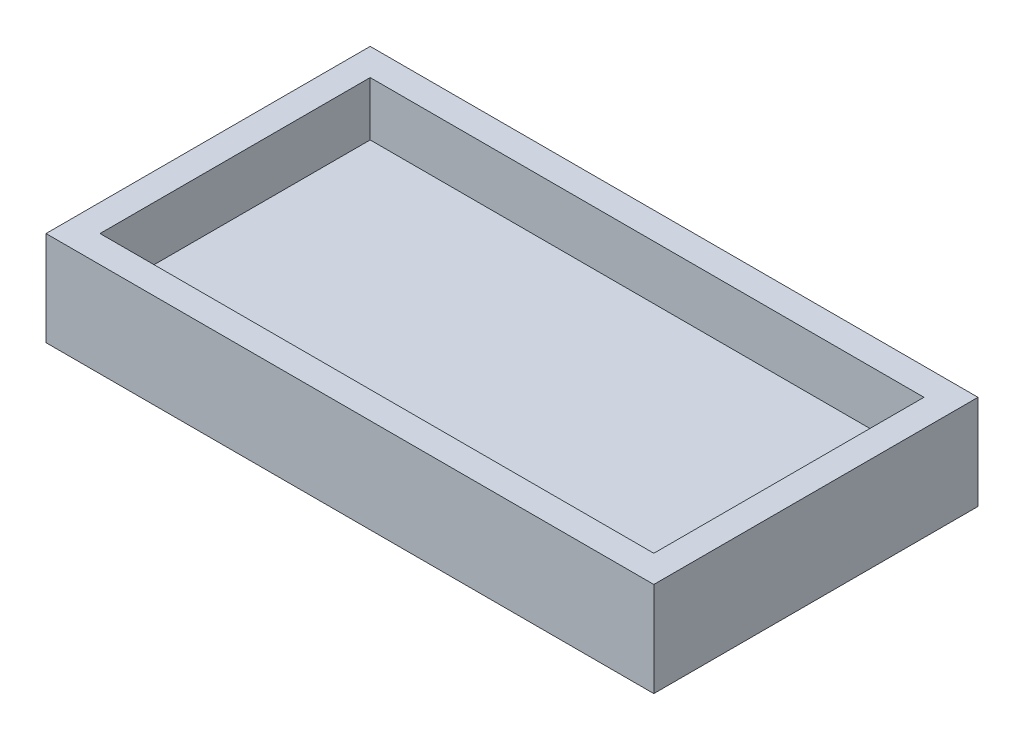
ISO-10303-21;
HEADER;
FILE_DESCRIPTION(('STEP AP214'),'2;1');
FILE_NAME('part.step','',(''),(''),'','','');
FILE_SCHEMA(('AUTOMOTIVE_DESIGN { 1 0 10303 214 1 1 1 1 }'));
ENDSEC;
DATA;
#1=APPLICATION_CONTEXT('core data for automotive mechanical design processes');
#2=APPLICATION_PROTOCOL_DEFINITION('international standard','automotive_design',2000,#1);
#3=PRODUCT_CONTEXT('',#1,'mechanical');
#4=PRODUCT('Part','Part','',(#3));
#5=PRODUCT_RELATED_PRODUCT_CATEGORY('part','',(#4));
#6=PRODUCT_DEFINITION_FORMATION('','',#4);
#7=PRODUCT_DEFINITION_CONTEXT('part definition',#1,'design');
#8=PRODUCT_DEFINITION('design','',#6,#7);
#9=PRODUCT_DEFINITION_SHAPE('','',#8);
#10=(LENGTH_UNIT() NAMED_UNIT(*) SI_UNIT(.MILLI.,.METRE.));
#11=(NAMED_UNIT(*) PLANE_ANGLE_UNIT() SI_UNIT($,.RADIAN.));
#12=(NAMED_UNIT(*) SI_UNIT($,.STERADIAN.) SOLID_ANGLE_UNIT());
#13=UNCERTAINTY_MEASURE_WITH_UNIT(LENGTH_MEASURE(1.E-05),#10,'distance_accuracy_value','');
#14=(GEOMETRIC_REPRESENTATION_CONTEXT(3) GLOBAL_UNCERTAINTY_ASSIGNED_CONTEXT((#13)) GLOBAL_UNIT_ASSIGNED_CONTEXT((#10,
#11,#12)) REPRESENTATION_CONTEXT('',''));
#15=CARTESIAN_POINT('',(0.,0.,0.));
#16=DIRECTION('',(0.,0.,1.));
#17=DIRECTION('',(1.,0.,0.));
#18=AXIS2_PLACEMENT_3D('',#15,#16,#17);
#19=CARTESIAN_POINT('',(0.,3.,0.));
#20=DIRECTION('',(0.,1.,0.));
#21=DIRECTION('',(0.,0.,1.));
#22=AXIS2_PLACEMENT_3D('',#19,#20,#21);
#23=PLANE('',#22);
#24=DIRECTION('',(0.,0.,-1.));
#25=VECTOR('',#24,1.);
#26=CARTESIAN_POINT('',(20.5,3.,-10.));
#27=LINE('',#26,#25);
#28=CARTESIAN_POINT('',(20.5,3.,10.));
#29=VERTEX_POINT('',#28);
#30=CARTESIAN_POINT('',(20.5,3.,-10.));
#31=VERTEX_POINT('',#30);
#32=EDGE_CURVE('E147',#29,#31,#27,.T.);
#33=ORIENTED_EDGE('',*,*,#32,.T.);
#34=DIRECTION('',(-1.,0.,0.));
#35=VECTOR('',#34,1.);
#36=CARTESIAN_POINT('',(-20.5,3.,-10.));
#37=LINE('',#36,#35);
#38=CARTESIAN_POINT('',(-20.5,3.,-10.));
#39=VERTEX_POINT('',#38);
#40=EDGE_CURVE('E60',#31,#39,#37,.T.);
#41=ORIENTED_EDGE('',*,*,#40,.T.);
#42=DIRECTION('',(0.,0.,1.));
#43=VECTOR('',#42,1.);
#44=CARTESIAN_POINT('',(-20.5,3.,-10.));
#45=LINE('',#44,#43);
#46=CARTESIAN_POINT('',(-20.5,3.,9.99999999999999));
#47=VERTEX_POINT('',#46);
#48=EDGE_CURVE('E45',#39,#47,#45,.T.);
#49=ORIENTED_EDGE('',*,*,#48,.T.);
#50=DIRECTION('',(1.,0.,0.));
#51=VECTOR('',#50,1.);
#52=CARTESIAN_POINT('',(-20.5,3.,10.));
#53=LINE('',#52,#51);
#54=EDGE_CURVE('E12',#47,#29,#53,.T.);
#55=ORIENTED_EDGE('',*,*,#54,.T.);
#56=EDGE_LOOP('',(#33,#41,#49,#55));
#57=FACE_BOUND('',#56,.T.);
#58=ADVANCED_FACE('F37',(#57),#23,.T.);
#59=CARTESIAN_POINT('',(22.5,62.,-12.));
#60=DIRECTION('',(0.,0.,-1.));
#61=DIRECTION('',(-1.,0.,0.));
#62=AXIS2_PLACEMENT_3D('',#59,#60,#61);
#63=PLANE('',#62);
#64=DIRECTION('',(0.,-1.,0.));
#65=VECTOR('',#64,1.);
#66=CARTESIAN_POINT('',(-22.5,62.,-12.));
#67=LINE('',#66,#65);
#68=CARTESIAN_POINT('',(-22.5,7.,-12.));
#69=VERTEX_POINT('',#68);
#70=CARTESIAN_POINT('',(-22.5,0.,-12.));
#71=VERTEX_POINT('',#70);
#72=EDGE_CURVE('E115',#69,#71,#67,.T.);
#73=ORIENTED_EDGE('',*,*,#72,.F.);
#74=DIRECTION('',(1.,0.,0.));
#75=VECTOR('',#74,1.);
#76=CARTESIAN_POINT('',(22.5,7.,-12.));
#77=LINE('',#76,#75);
#78=CARTESIAN_POINT('',(22.5,7.,-12.));
#79=VERTEX_POINT('',#78);
#80=EDGE_CURVE('E148',#69,#79,#77,.T.);
#81=ORIENTED_EDGE('',*,*,#80,.T.);
#82=DIRECTION('',(0.,-1.,0.));
#83=VECTOR('',#82,1.);
#84=CARTESIAN_POINT('',(22.5,62.,-12.));
#85=LINE('',#84,#83);
#86=CARTESIAN_POINT('',(22.5,0.,-12.));
#87=VERTEX_POINT('',#86);
#88=EDGE_CURVE('E129',#79,#87,#85,.T.);
#89=ORIENTED_EDGE('',*,*,#88,.T.);
#90=DIRECTION('',(1.,0.,0.));
#91=VECTOR('',#90,1.);
#92=CARTESIAN_POINT('',(22.5,0.,-12.));
#93=LINE('',#92,#91);
#94=EDGE_CURVE('E134',#71,#87,#93,.T.);
#95=ORIENTED_EDGE('',*,*,#94,.F.);
#96=EDGE_LOOP('',(#73,#81,#89,#95));
#97=FACE_BOUND('',#96,.T.);
#98=ADVANCED_FACE('F182',(#97),#63,.T.);
#99=CARTESIAN_POINT('',(-22.5,62.,-12.));
#100=DIRECTION('',(-1.,0.,0.));
#101=DIRECTION('',(0.,0.,1.));
#102=AXIS2_PLACEMENT_3D('',#99,#100,#101);
#103=PLANE('',#102);
#104=DIRECTION('',(0.,-1.,0.));
#105=VECTOR('',#104,1.);
#106=CARTESIAN_POINT('',(-22.5,62.,12.));
#107=LINE('',#106,#105);
#108=CARTESIAN_POINT('',(-22.5,7.,12.));
#109=VERTEX_POINT('',#108);
#110=CARTESIAN_POINT('',(-22.5,0.,12.));
#111=VERTEX_POINT('',#110);
#112=EDGE_CURVE('E114',#109,#111,#107,.T.);
#113=ORIENTED_EDGE('',*,*,#112,.F.);
#114=DIRECTION('',(0.,0.,-1.));
#115=VECTOR('',#114,1.);
#116=CARTESIAN_POINT('',(-22.5,7.,-12.));
#117=LINE('',#116,#115);
#118=EDGE_CURVE('E111',#109,#69,#117,.T.);
#119=ORIENTED_EDGE('',*,*,#118,.T.);
#120=ORIENTED_EDGE('',*,*,#72,.T.);
#121=DIRECTION('',(0.,0.,-1.));
#122=VECTOR('',#121,1.);
#123=CARTESIAN_POINT('',(-22.5,0.,-12.));
#124=LINE('',#123,#122);
#125=EDGE_CURVE('E143',#111,#71,#124,.T.);
#126=ORIENTED_EDGE('',*,*,#125,.F.);
#127=EDGE_LOOP('',(#113,#119,#120,#126));
#128=FACE_BOUND('',#127,.T.);
#129=ADVANCED_FACE('F186',(#128),#103,.T.);
#130=CARTESIAN_POINT('',(22.5,62.,12.));
#131=DIRECTION('',(0.,0.,1.));
#132=DIRECTION('',(1.,0.,0.));
#133=AXIS2_PLACEMENT_3D('',#130,#131,#132);
#134=PLANE('',#133);
#135=DIRECTION('',(0.,-1.,0.));
#136=VECTOR('',#135,1.);
#137=CARTESIAN_POINT('',(22.5,62.,12.));
#138=LINE('',#137,#136);
#139=CARTESIAN_POINT('',(22.5,7.,12.));
#140=VERTEX_POINT('',#139);
#141=CARTESIAN_POINT('',(22.5,0.,12.));
#142=VERTEX_POINT('',#141);
#143=EDGE_CURVE('E118',#140,#142,#138,.T.);
#144=ORIENTED_EDGE('',*,*,#143,.F.);
#145=DIRECTION('',(-1.,0.,0.));
#146=VECTOR('',#145,1.);
#147=CARTESIAN_POINT('',(22.5,7.,12.));
#148=LINE('',#147,#146);
#149=EDGE_CURVE('E103',#140,#109,#148,.T.);
#150=ORIENTED_EDGE('',*,*,#149,.T.);
#151=ORIENTED_EDGE('',*,*,#112,.T.);
#152=DIRECTION('',(-1.,0.,0.));
#153=VECTOR('',#152,1.);
#154=CARTESIAN_POINT('',(22.5,0.,12.));
#155=LINE('',#154,#153);
#156=EDGE_CURVE('E121',#142,#111,#155,.T.);
#157=ORIENTED_EDGE('',*,*,#156,.F.);
#158=EDGE_LOOP('',(#144,#150,#151,#157));
#159=FACE_BOUND('',#158,.T.);
#160=ADVANCED_FACE('F119',(#159),#134,.T.);
#161=CARTESIAN_POINT('',(22.5,62.,-12.));
#162=DIRECTION('',(1.,0.,0.));
#163=DIRECTION('',(0.,0.,-1.));
#164=AXIS2_PLACEMENT_3D('',#161,#162,#163);
#165=PLANE('',#164);
#166=ORIENTED_EDGE('',*,*,#88,.F.);
#167=DIRECTION('',(0.,0.,1.));
#168=VECTOR('',#167,1.);
#169=CARTESIAN_POINT('',(22.5,7.,-12.));
#170=LINE('',#169,#168);
#171=EDGE_CURVE('E108',#79,#140,#170,.T.);
#172=ORIENTED_EDGE('',*,*,#171,.T.);
#173=ORIENTED_EDGE('',*,*,#143,.T.);
#174=DIRECTION('',(0.,0.,1.));
#175=VECTOR('',#174,1.);
#176=CARTESIAN_POINT('',(22.5,0.,-12.));
#177=LINE('',#176,#175);
#178=EDGE_CURVE('E270',#87,#142,#177,.T.);
#179=ORIENTED_EDGE('',*,*,#178,.F.);
#180=EDGE_LOOP('',(#166,#172,#173,#179));
#181=FACE_BOUND('',#180,.T.);
#182=ADVANCED_FACE('F128',(#181),#165,.T.);
#183=CARTESIAN_POINT('',(20.5,62.,-10.));
#184=DIRECTION('',(1.,0.,0.));
#185=DIRECTION('',(0.,0.,-1.));
#186=AXIS2_PLACEMENT_3D('',#183,#184,#185);
#187=PLANE('',#186);
#188=ORIENTED_EDGE('',*,*,#32,.F.);
#189=DIRECTION('',(0.,-1.,0.));
#190=VECTOR('',#189,1.);
#191=CARTESIAN_POINT('',(20.5,62.,10.));
#192=LINE('',#191,#190);
#193=CARTESIAN_POINT('',(20.5,7.,10.));
#194=VERTEX_POINT('',#193);
#195=EDGE_CURVE('E52',#194,#29,#192,.T.);
#196=ORIENTED_EDGE('',*,*,#195,.F.);
#197=DIRECTION('',(0.,0.,1.));
#198=VECTOR('',#197,1.);
#199=CARTESIAN_POINT('',(20.5,7.,-10.));
#200=LINE('',#199,#198);
#201=CARTESIAN_POINT('',(20.5,7.,-10.));
#202=VERTEX_POINT('',#201);
#203=EDGE_CURVE('E136',#202,#194,#200,.T.);
#204=ORIENTED_EDGE('',*,*,#203,.F.);
#205=DIRECTION('',(0.,-1.,0.));
#206=VECTOR('',#205,1.);
#207=CARTESIAN_POINT('',(20.5,62.,-10.));
#208=LINE('',#207,#206);
#209=EDGE_CURVE('E125',#202,#31,#208,.T.);
#210=ORIENTED_EDGE('',*,*,#209,.T.);
#211=EDGE_LOOP('',(#188,#196,#204,#210));
#212=FACE_BOUND('',#211,.T.);
#213=ADVANCED_FACE('F189',(#212),#187,.F.);
#214=CARTESIAN_POINT('',(20.5,62.,-10.));
#215=DIRECTION('',(0.,0.,-1.));
#216=DIRECTION('',(-1.,0.,0.));
#217=AXIS2_PLACEMENT_3D('',#214,#215,#216);
#218=PLANE('',#217);
#219=ORIENTED_EDGE('',*,*,#40,.F.);
#220=ORIENTED_EDGE('',*,*,#209,.F.);
#221=DIRECTION('',(1.,0.,0.));
#222=VECTOR('',#221,1.);
#223=CARTESIAN_POINT('',(20.5,7.,-10.));
#224=LINE('',#223,#222);
#225=CARTESIAN_POINT('',(-20.5,7.,-10.));
#226=VERTEX_POINT('',#225);
#227=EDGE_CURVE('E140',#226,#202,#224,.T.);
#228=ORIENTED_EDGE('',*,*,#227,.F.);
#229=DIRECTION('',(0.,-1.,0.));
#230=VECTOR('',#229,1.);
#231=CARTESIAN_POINT('',(-20.5,62.,-10.));
#232=LINE('',#231,#230);
#233=EDGE_CURVE('E156',#226,#39,#232,.T.);
#234=ORIENTED_EDGE('',*,*,#233,.T.);
#235=EDGE_LOOP('',(#219,#220,#228,#234));
#236=FACE_BOUND('',#235,.T.);
#237=ADVANCED_FACE('F170',(#236),#218,.F.);
#238=CARTESIAN_POINT('',(-20.5,62.,-10.));
#239=DIRECTION('',(-1.,0.,0.));
#240=DIRECTION('',(0.,0.,1.));
#241=AXIS2_PLACEMENT_3D('',#238,#239,#240);
#242=PLANE('',#241);
#243=ORIENTED_EDGE('',*,*,#48,.F.);
#244=ORIENTED_EDGE('',*,*,#233,.F.);
#245=DIRECTION('',(0.,0.,-1.));
#246=VECTOR('',#245,1.);
#247=CARTESIAN_POINT('',(-20.5,7.,-10.));
#248=LINE('',#247,#246);
#249=CARTESIAN_POINT('',(-20.5,7.,9.99999999999999));
#250=VERTEX_POINT('',#249);
#251=EDGE_CURVE('E144',#250,#226,#248,.T.);
#252=ORIENTED_EDGE('',*,*,#251,.F.);
#253=DIRECTION('',(0.,-1.,0.));
#254=VECTOR('',#253,1.);
#255=CARTESIAN_POINT('',(-20.5,62.,9.99999999999999));
#256=LINE('',#255,#254);
#257=EDGE_CURVE('E158',#250,#47,#256,.T.);
#258=ORIENTED_EDGE('',*,*,#257,.T.);
#259=EDGE_LOOP('',(#243,#244,#252,#258));
#260=FACE_BOUND('',#259,.T.);
#261=ADVANCED_FACE('F168',(#260),#242,.F.);
#262=CARTESIAN_POINT('',(20.5,62.,10.));
#263=DIRECTION('',(0.,0.,1.));
#264=DIRECTION('',(1.,0.,0.));
#265=AXIS2_PLACEMENT_3D('',#262,#263,#264);
#266=PLANE('',#265);
#267=ORIENTED_EDGE('',*,*,#54,.F.);
#268=ORIENTED_EDGE('',*,*,#257,.F.);
#269=DIRECTION('',(-1.,0.,0.));
#270=VECTOR('',#269,1.);
#271=CARTESIAN_POINT('',(20.5,7.,10.));
#272=LINE('',#271,#270);
#273=EDGE_CURVE('E139',#194,#250,#272,.T.);
#274=ORIENTED_EDGE('',*,*,#273,.F.);
#275=ORIENTED_EDGE('',*,*,#195,.T.);
#276=EDGE_LOOP('',(#267,#268,#274,#275));
#277=FACE_BOUND('',#276,.T.);
#278=ADVANCED_FACE('F171',(#277),#266,.F.);
#279=CARTESIAN_POINT('',(0.,7.,0.));
#280=DIRECTION('',(0.,1.,0.));
#281=DIRECTION('',(0.,0.,1.));
#282=AXIS2_PLACEMENT_3D('',#279,#280,#281);
#283=PLANE('',#282);
#284=ORIENTED_EDGE('',*,*,#80,.F.);
#285=ORIENTED_EDGE('',*,*,#118,.F.);
#286=ORIENTED_EDGE('',*,*,#149,.F.);
#287=ORIENTED_EDGE('',*,*,#171,.F.);
#288=EDGE_LOOP('',(#284,#285,#286,#287));
#289=FACE_BOUND('',#288,.T.);
#290=ORIENTED_EDGE('',*,*,#227,.T.);
#291=ORIENTED_EDGE('',*,*,#203,.T.);
#292=ORIENTED_EDGE('',*,*,#273,.T.);
#293=ORIENTED_EDGE('',*,*,#251,.T.);
#294=EDGE_LOOP('',(#290,#291,#292,#293));
#295=FACE_BOUND('',#294,.T.);
#296=ADVANCED_FACE('F105',(#289,#295),#283,.T.);
#297=CARTESIAN_POINT('',(0.,0.,0.));
#298=DIRECTION('',(0.,1.,0.));
#299=DIRECTION('',(0.,0.,1.));
#300=AXIS2_PLACEMENT_3D('',#297,#298,#299);
#301=PLANE('',#300);
#302=ORIENTED_EDGE('',*,*,#94,.T.);
#303=ORIENTED_EDGE('',*,*,#178,.T.);
#304=ORIENTED_EDGE('',*,*,#156,.T.);
#305=ORIENTED_EDGE('',*,*,#125,.T.);
#306=EDGE_LOOP('',(#302,#303,#304,#305));
#307=FACE_BOUND('',#306,.T.);
#308=ADVANCED_FACE('F39',(#307),#301,.F.);
#309=CLOSED_SHELL('',(#58,#98,#129,#160,#182,#213,#237,#261,#278,#296,#308));
#310=MANIFOLD_SOLID_BREP('B2',#309);
#311=ADVANCED_BREP_SHAPE_REPRESENTATION('',(#18,#310),#14);
#312=SHAPE_DEFINITION_REPRESENTATION(#9,#311);
ENDSEC;
END-ISO-10303-21;
